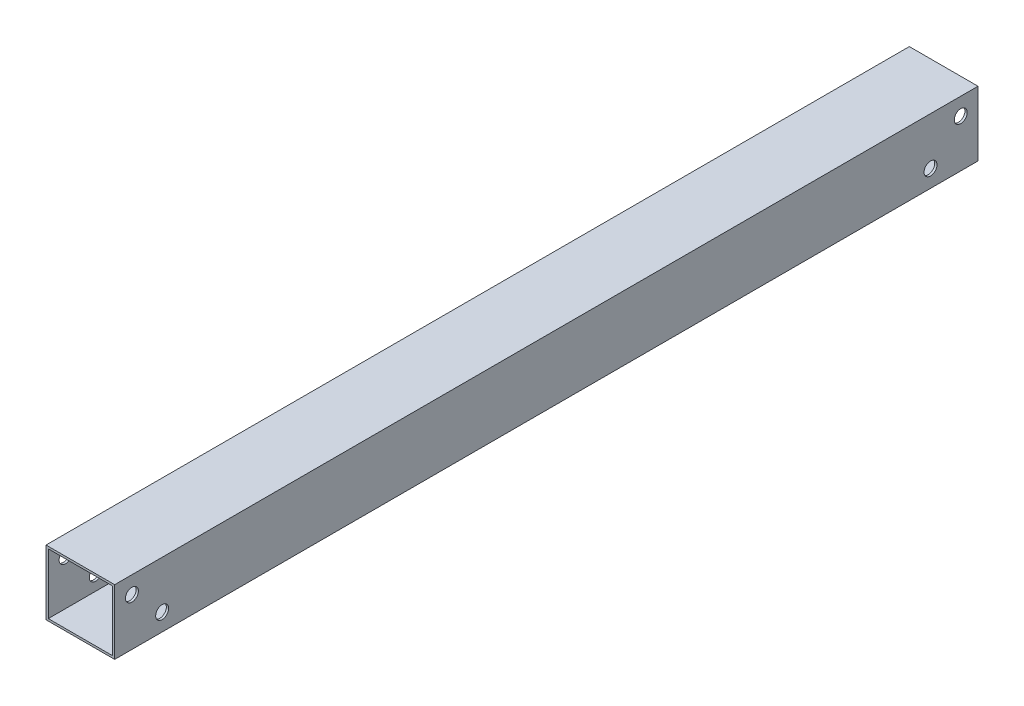
ISO-10303-21;
HEADER;
FILE_DESCRIPTION(('STEP AP214'),'2;1');
FILE_NAME('part.step','',(''),(''),'','','');
FILE_SCHEMA(('AUTOMOTIVE_DESIGN { 1 0 10303 214 1 1 1 1 }'));
ENDSEC;
DATA;
#1=APPLICATION_CONTEXT('core data for automotive mechanical design processes');
#2=APPLICATION_PROTOCOL_DEFINITION('international standard','automotive_design',2000,#1);
#3=PRODUCT_CONTEXT('',#1,'mechanical');
#4=PRODUCT('Part','Part','',(#3));
#5=PRODUCT_RELATED_PRODUCT_CATEGORY('part','',(#4));
#6=PRODUCT_DEFINITION_FORMATION('','',#4);
#7=PRODUCT_DEFINITION_CONTEXT('part definition',#1,'design');
#8=PRODUCT_DEFINITION('design','',#6,#7);
#9=PRODUCT_DEFINITION_SHAPE('','',#8);
#10=(LENGTH_UNIT() NAMED_UNIT(*) SI_UNIT(.MILLI.,.METRE.));
#11=(NAMED_UNIT(*) PLANE_ANGLE_UNIT() SI_UNIT($,.RADIAN.));
#12=(NAMED_UNIT(*) SI_UNIT($,.STERADIAN.) SOLID_ANGLE_UNIT());
#13=UNCERTAINTY_MEASURE_WITH_UNIT(LENGTH_MEASURE(1.E-05),#10,'distance_accuracy_value','');
#14=(GEOMETRIC_REPRESENTATION_CONTEXT(3) GLOBAL_UNCERTAINTY_ASSIGNED_CONTEXT((#13)) GLOBAL_UNIT_ASSIGNED_CONTEXT((#10,
#11,#12)) REPRESENTATION_CONTEXT('',''));
#15=CARTESIAN_POINT('',(0.,0.,0.));
#16=DIRECTION('',(0.,0.,1.));
#17=DIRECTION('',(1.,0.,0.));
#18=AXIS2_PLACEMENT_3D('',#15,#16,#17);
#19=CARTESIAN_POINT('',(0.,0.,-200.));
#20=DIRECTION('',(-1.,0.,0.));
#21=DIRECTION('',(0.,0.,1.));
#22=AXIS2_PLACEMENT_3D('',#19,#20,#21);
#23=PLANE('',#22);
#24=CARTESIAN_POINT('',(0.,11.,-4.));
#25=DIRECTION('',(-1.,0.,0.));
#26=DIRECTION('',(0.,0.,1.));
#27=AXIS2_PLACEMENT_3D('',#24,#25,#26);
#28=CIRCLE('',#27,1.5);
#29=CARTESIAN_POINT('',(0.,11.,-2.5));
#30=VERTEX_POINT('',#29);
#31=EDGE_CURVE('E137',#30,#30,#28,.T.);
#32=ORIENTED_EDGE('',*,*,#31,.F.);
#33=EDGE_LOOP('',(#32));
#34=FACE_BOUND('',#33,.T.);
#35=CARTESIAN_POINT('',(0.,4.,-11.));
#36=DIRECTION('',(-1.,0.,0.));
#37=DIRECTION('',(0.,0.,1.));
#38=AXIS2_PLACEMENT_3D('',#35,#36,#37);
#39=CIRCLE('',#38,1.5);
#40=CARTESIAN_POINT('',(0.,4.,-9.5));
#41=VERTEX_POINT('',#40);
#42=EDGE_CURVE('E221',#41,#41,#39,.T.);
#43=ORIENTED_EDGE('',*,*,#42,.F.);
#44=EDGE_LOOP('',(#43));
#45=FACE_BOUND('',#44,.T.);
#46=CARTESIAN_POINT('',(0.,4.,-189.));
#47=DIRECTION('',(-1.,0.,0.));
#48=DIRECTION('',(0.,0.,1.));
#49=AXIS2_PLACEMENT_3D('',#46,#47,#48);
#50=CIRCLE('',#49,1.5);
#51=CARTESIAN_POINT('',(0.,4.,-187.5));
#52=VERTEX_POINT('',#51);
#53=EDGE_CURVE('E215',#52,#52,#50,.T.);
#54=ORIENTED_EDGE('',*,*,#53,.F.);
#55=EDGE_LOOP('',(#54));
#56=FACE_BOUND('',#55,.T.);
#57=CARTESIAN_POINT('',(0.,11.,-196.));
#58=DIRECTION('',(-1.,0.,0.));
#59=DIRECTION('',(0.,0.,1.));
#60=AXIS2_PLACEMENT_3D('',#57,#58,#59);
#61=CIRCLE('',#60,1.5);
#62=CARTESIAN_POINT('',(0.,11.,-194.5));
#63=VERTEX_POINT('',#62);
#64=EDGE_CURVE('E210',#63,#63,#61,.T.);
#65=ORIENTED_EDGE('',*,*,#64,.F.);
#66=EDGE_LOOP('',(#65));
#67=FACE_BOUND('',#66,.T.);
#68=DIRECTION('',(0.,-1.,0.));
#69=VECTOR('',#68,1.);
#70=CARTESIAN_POINT('',(0.,0.,0.));
#71=LINE('',#70,#69);
#72=CARTESIAN_POINT('',(0.,15.,0.));
#73=VERTEX_POINT('',#72);
#74=CARTESIAN_POINT('',(0.,0.,0.));
#75=VERTEX_POINT('',#74);
#76=EDGE_CURVE('E155',#73,#75,#71,.T.);
#77=ORIENTED_EDGE('',*,*,#76,.F.);
#78=DIRECTION('',(0.,0.,1.));
#79=VECTOR('',#78,1.);
#80=CARTESIAN_POINT('',(0.,15.,-200.));
#81=LINE('',#80,#79);
#82=CARTESIAN_POINT('',(0.,15.,-200.));
#83=VERTEX_POINT('',#82);
#84=EDGE_CURVE('E11',#83,#73,#81,.T.);
#85=ORIENTED_EDGE('',*,*,#84,.F.);
#86=DIRECTION('',(0.,-1.,0.));
#87=VECTOR('',#86,1.);
#88=CARTESIAN_POINT('',(0.,0.,-200.));
#89=LINE('',#88,#87);
#90=CARTESIAN_POINT('',(0.,0.,-200.));
#91=VERTEX_POINT('',#90);
#92=EDGE_CURVE('E161',#83,#91,#89,.T.);
#93=ORIENTED_EDGE('',*,*,#92,.T.);
#94=DIRECTION('',(0.,0.,1.));
#95=VECTOR('',#94,1.);
#96=CARTESIAN_POINT('',(0.,0.,-200.));
#97=LINE('',#96,#95);
#98=EDGE_CURVE('E178',#91,#75,#97,.T.);
#99=ORIENTED_EDGE('',*,*,#98,.T.);
#100=EDGE_LOOP('',(#77,#85,#93,#99));
#101=FACE_BOUND('',#100,.T.);
#102=ADVANCED_FACE('F43',(#34,#45,#56,#67,#101),#23,.T.);
#103=CARTESIAN_POINT('',(0.,15.,-200.));
#104=DIRECTION('',(0.,1.,0.));
#105=DIRECTION('',(0.,0.,1.));
#106=AXIS2_PLACEMENT_3D('',#103,#104,#105);
#107=PLANE('',#106);
#108=DIRECTION('',(-1.,0.,0.));
#109=VECTOR('',#108,1.);
#110=CARTESIAN_POINT('',(0.,15.,0.));
#111=LINE('',#110,#109);
#112=CARTESIAN_POINT('',(15.9091063500961,15.,0.));
#113=VERTEX_POINT('',#112);
#114=EDGE_CURVE('E166',#113,#73,#111,.T.);
#115=ORIENTED_EDGE('',*,*,#114,.F.);
#116=DIRECTION('',(0.,0.,1.));
#117=VECTOR('',#116,1.);
#118=CARTESIAN_POINT('',(15.9091063500961,15.,-200.));
#119=LINE('',#118,#117);
#120=CARTESIAN_POINT('',(15.9091063500961,15.,-200.));
#121=VERTEX_POINT('',#120);
#122=EDGE_CURVE('E52',#121,#113,#119,.T.);
#123=ORIENTED_EDGE('',*,*,#122,.F.);
#124=DIRECTION('',(-1.,0.,0.));
#125=VECTOR('',#124,1.);
#126=CARTESIAN_POINT('',(0.,15.,-200.));
#127=LINE('',#126,#125);
#128=EDGE_CURVE('E174',#121,#83,#127,.T.);
#129=ORIENTED_EDGE('',*,*,#128,.T.);
#130=ORIENTED_EDGE('',*,*,#84,.T.);
#131=EDGE_LOOP('',(#115,#123,#129,#130));
#132=FACE_BOUND('',#131,.T.);
#133=ADVANCED_FACE('F269',(#132),#107,.T.);
#134=CARTESIAN_POINT('',(15.9091063500961,0.,-200.));
#135=DIRECTION('',(1.,0.,0.));
#136=DIRECTION('',(0.,0.,-1.));
#137=AXIS2_PLACEMENT_3D('',#134,#135,#136);
#138=PLANE('',#137);
#139=CARTESIAN_POINT('',(15.9091063500961,11.,-4.));
#140=DIRECTION('',(1.,0.,0.));
#141=DIRECTION('',(0.,0.,-1.));
#142=AXIS2_PLACEMENT_3D('',#139,#140,#141);
#143=CIRCLE('',#142,1.5);
#144=CARTESIAN_POINT('',(15.9091063500961,11.,-5.5));
#145=VERTEX_POINT('',#144);
#146=EDGE_CURVE('E205',#145,#145,#143,.T.);
#147=ORIENTED_EDGE('',*,*,#146,.F.);
#148=EDGE_LOOP('',(#147));
#149=FACE_BOUND('',#148,.T.);
#150=CARTESIAN_POINT('',(15.9091063500961,4.,-11.));
#151=DIRECTION('',(1.,0.,0.));
#152=DIRECTION('',(0.,0.,-1.));
#153=AXIS2_PLACEMENT_3D('',#150,#151,#152);
#154=CIRCLE('',#153,1.5);
#155=CARTESIAN_POINT('',(15.9091063500961,4.,-12.5));
#156=VERTEX_POINT('',#155);
#157=EDGE_CURVE('E331',#156,#156,#154,.T.);
#158=ORIENTED_EDGE('',*,*,#157,.F.);
#159=EDGE_LOOP('',(#158));
#160=FACE_BOUND('',#159,.T.);
#161=CARTESIAN_POINT('',(15.9091063500961,4.,-189.));
#162=DIRECTION('',(1.,0.,0.));
#163=DIRECTION('',(0.,0.,-1.));
#164=AXIS2_PLACEMENT_3D('',#161,#162,#163);
#165=CIRCLE('',#164,1.5);
#166=CARTESIAN_POINT('',(15.9091063500961,4.,-190.5));
#167=VERTEX_POINT('',#166);
#168=EDGE_CURVE('E348',#167,#167,#165,.T.);
#169=ORIENTED_EDGE('',*,*,#168,.F.);
#170=EDGE_LOOP('',(#169));
#171=FACE_BOUND('',#170,.T.);
#172=CARTESIAN_POINT('',(15.9091063500961,11.,-196.));
#173=DIRECTION('',(1.,0.,0.));
#174=DIRECTION('',(0.,0.,-1.));
#175=AXIS2_PLACEMENT_3D('',#172,#173,#174);
#176=CIRCLE('',#175,1.5);
#177=CARTESIAN_POINT('',(15.9091063500961,11.,-197.5));
#178=VERTEX_POINT('',#177);
#179=EDGE_CURVE('E344',#178,#178,#176,.T.);
#180=ORIENTED_EDGE('',*,*,#179,.F.);
#181=EDGE_LOOP('',(#180));
#182=FACE_BOUND('',#181,.T.);
#183=DIRECTION('',(0.,1.,0.));
#184=VECTOR('',#183,1.);
#185=CARTESIAN_POINT('',(15.9091063500961,0.,0.));
#186=LINE('',#185,#184);
#187=CARTESIAN_POINT('',(15.9091063500961,0.,0.));
#188=VERTEX_POINT('',#187);
#189=EDGE_CURVE('E186',#188,#113,#186,.T.);
#190=ORIENTED_EDGE('',*,*,#189,.F.);
#191=DIRECTION('',(0.,0.,1.));
#192=VECTOR('',#191,1.);
#193=CARTESIAN_POINT('',(15.9091063500961,0.,-200.));
#194=LINE('',#193,#192);
#195=CARTESIAN_POINT('',(15.9091063500961,0.,-200.));
#196=VERTEX_POINT('',#195);
#197=EDGE_CURVE('E195',#196,#188,#194,.T.);
#198=ORIENTED_EDGE('',*,*,#197,.F.);
#199=DIRECTION('',(0.,1.,0.));
#200=VECTOR('',#199,1.);
#201=CARTESIAN_POINT('',(15.9091063500961,0.,-200.));
#202=LINE('',#201,#200);
#203=EDGE_CURVE('E170',#196,#121,#202,.T.);
#204=ORIENTED_EDGE('',*,*,#203,.T.);
#205=ORIENTED_EDGE('',*,*,#122,.T.);
#206=EDGE_LOOP('',(#190,#198,#204,#205));
#207=FACE_BOUND('',#206,.T.);
#208=ADVANCED_FACE('F274',(#149,#160,#171,#182,#207),#138,.T.);
#209=CARTESIAN_POINT('',(0.,0.,-200.));
#210=DIRECTION('',(0.,-1.,0.));
#211=DIRECTION('',(1.,0.,0.));
#212=AXIS2_PLACEMENT_3D('',#209,#210,#211);
#213=PLANE('',#212);
#214=DIRECTION('',(1.,0.,0.));
#215=VECTOR('',#214,1.);
#216=CARTESIAN_POINT('',(0.,0.,0.));
#217=LINE('',#216,#215);
#218=EDGE_CURVE('E182',#75,#188,#217,.T.);
#219=ORIENTED_EDGE('',*,*,#218,.F.);
#220=ORIENTED_EDGE('',*,*,#98,.F.);
#221=DIRECTION('',(1.,0.,0.));
#222=VECTOR('',#221,1.);
#223=CARTESIAN_POINT('',(0.,0.,-200.));
#224=LINE('',#223,#222);
#225=EDGE_CURVE('E165',#91,#196,#224,.T.);
#226=ORIENTED_EDGE('',*,*,#225,.T.);
#227=ORIENTED_EDGE('',*,*,#197,.T.);
#228=EDGE_LOOP('',(#219,#220,#226,#227));
#229=FACE_BOUND('',#228,.T.);
#230=ADVANCED_FACE('F296',(#229),#213,.T.);
#231=CARTESIAN_POINT('',(0.,0.,-200.));
#232=DIRECTION('',(0.,0.,-1.));
#233=DIRECTION('',(-1.,0.,0.));
#234=AXIS2_PLACEMENT_3D('',#231,#232,#233);
#235=PLANE('',#234);
#236=DIRECTION('',(0.,1.,0.));
#237=VECTOR('',#236,1.);
#238=CARTESIAN_POINT('',(15.3788028050929,14.5,-200.));
#239=LINE('',#238,#237);
#240=CARTESIAN_POINT('',(15.3788028050929,0.499999999999997,-200.));
#241=VERTEX_POINT('',#240);
#242=CARTESIAN_POINT('',(15.3788028050929,14.5,-200.));
#243=VERTEX_POINT('',#242);
#244=EDGE_CURVE('E111',#241,#243,#239,.T.);
#245=ORIENTED_EDGE('',*,*,#244,.T.);
#246=DIRECTION('',(-1.,0.,0.));
#247=VECTOR('',#246,1.);
#248=CARTESIAN_POINT('',(0.530303545003203,14.5,-200.));
#249=LINE('',#248,#247);
#250=CARTESIAN_POINT('',(0.530303545003203,14.5,-200.));
#251=VERTEX_POINT('',#250);
#252=EDGE_CURVE('E121',#243,#251,#249,.T.);
#253=ORIENTED_EDGE('',*,*,#252,.T.);
#254=DIRECTION('',(0.,-1.,0.));
#255=VECTOR('',#254,1.);
#256=CARTESIAN_POINT('',(0.530303545003203,14.5,-200.));
#257=LINE('',#256,#255);
#258=CARTESIAN_POINT('',(0.530303545003203,0.499999999999997,-200.));
#259=VERTEX_POINT('',#258);
#260=EDGE_CURVE('E60',#251,#259,#257,.T.);
#261=ORIENTED_EDGE('',*,*,#260,.T.);
#262=DIRECTION('',(1.,0.,0.));
#263=VECTOR('',#262,1.);
#264=CARTESIAN_POINT('',(0.530303545003203,0.499999999999997,-200.));
#265=LINE('',#264,#263);
#266=EDGE_CURVE('E118',#259,#241,#265,.T.);
#267=ORIENTED_EDGE('',*,*,#266,.T.);
#268=EDGE_LOOP('',(#245,#253,#261,#267));
#269=FACE_BOUND('',#268,.T.);
#270=ORIENTED_EDGE('',*,*,#92,.F.);
#271=ORIENTED_EDGE('',*,*,#128,.F.);
#272=ORIENTED_EDGE('',*,*,#203,.F.);
#273=ORIENTED_EDGE('',*,*,#225,.F.);
#274=EDGE_LOOP('',(#270,#271,#272,#273));
#275=FACE_BOUND('',#274,.T.);
#276=ADVANCED_FACE('F126',(#269,#275),#235,.T.);
#277=CARTESIAN_POINT('',(0.,0.,0.));
#278=DIRECTION('',(0.,0.,-1.));
#279=DIRECTION('',(-1.,0.,0.));
#280=AXIS2_PLACEMENT_3D('',#277,#278,#279);
#281=PLANE('',#280);
#282=DIRECTION('',(-1.,0.,0.));
#283=VECTOR('',#282,1.);
#284=CARTESIAN_POINT('',(0.530303545003203,14.5,0.));
#285=LINE('',#284,#283);
#286=CARTESIAN_POINT('',(15.3788028050929,14.5,0.));
#287=VERTEX_POINT('',#286);
#288=CARTESIAN_POINT('',(0.530303545003203,14.5,0.));
#289=VERTEX_POINT('',#288);
#290=EDGE_CURVE('E146',#287,#289,#285,.T.);
#291=ORIENTED_EDGE('',*,*,#290,.F.);
#292=DIRECTION('',(0.,1.,0.));
#293=VECTOR('',#292,1.);
#294=CARTESIAN_POINT('',(15.3788028050929,14.5,0.));
#295=LINE('',#294,#293);
#296=CARTESIAN_POINT('',(15.3788028050929,0.499999999999997,0.));
#297=VERTEX_POINT('',#296);
#298=EDGE_CURVE('E68',#297,#287,#295,.T.);
#299=ORIENTED_EDGE('',*,*,#298,.F.);
#300=DIRECTION('',(1.,0.,0.));
#301=VECTOR('',#300,1.);
#302=CARTESIAN_POINT('',(0.530303545003203,0.499999999999997,0.));
#303=LINE('',#302,#301);
#304=CARTESIAN_POINT('',(0.530303545003203,0.499999999999997,0.));
#305=VERTEX_POINT('',#304);
#306=EDGE_CURVE('E130',#305,#297,#303,.T.);
#307=ORIENTED_EDGE('',*,*,#306,.F.);
#308=DIRECTION('',(0.,-1.,0.));
#309=VECTOR('',#308,1.);
#310=CARTESIAN_POINT('',(0.530303545003203,14.5,0.));
#311=LINE('',#310,#309);
#312=EDGE_CURVE('E134',#289,#305,#311,.T.);
#313=ORIENTED_EDGE('',*,*,#312,.F.);
#314=EDGE_LOOP('',(#291,#299,#307,#313));
#315=FACE_BOUND('',#314,.T.);
#316=ORIENTED_EDGE('',*,*,#76,.T.);
#317=ORIENTED_EDGE('',*,*,#218,.T.);
#318=ORIENTED_EDGE('',*,*,#189,.T.);
#319=ORIENTED_EDGE('',*,*,#114,.T.);
#320=EDGE_LOOP('',(#316,#317,#318,#319));
#321=FACE_BOUND('',#320,.T.);
#322=ADVANCED_FACE('F290',(#315,#321),#281,.F.);
#323=CARTESIAN_POINT('',(15.3788028050929,14.5,-200.));
#324=DIRECTION('',(1.,0.,0.));
#325=DIRECTION('',(0.,1.,0.));
#326=AXIS2_PLACEMENT_3D('',#323,#324,#325);
#327=PLANE('',#326);
#328=CARTESIAN_POINT('',(15.3788028050929,11.,-4.));
#329=DIRECTION('',(1.,0.,0.));
#330=DIRECTION('',(0.,1.,0.));
#331=AXIS2_PLACEMENT_3D('',#328,#329,#330);
#332=CIRCLE('',#331,1.5);
#333=CARTESIAN_POINT('',(15.3788028050929,12.5,-4.));
#334=VERTEX_POINT('',#333);
#335=EDGE_CURVE('E234',#334,#334,#332,.T.);
#336=ORIENTED_EDGE('',*,*,#335,.T.);
#337=EDGE_LOOP('',(#336));
#338=FACE_BOUND('',#337,.T.);
#339=CARTESIAN_POINT('',(15.3788028050929,4.,-11.));
#340=DIRECTION('',(1.,0.,0.));
#341=DIRECTION('',(0.,1.,0.));
#342=AXIS2_PLACEMENT_3D('',#339,#340,#341);
#343=CIRCLE('',#342,1.5);
#344=CARTESIAN_POINT('',(15.3788028050929,5.5,-11.));
#345=VERTEX_POINT('',#344);
#346=EDGE_CURVE('E214',#345,#345,#343,.T.);
#347=ORIENTED_EDGE('',*,*,#346,.T.);
#348=EDGE_LOOP('',(#347));
#349=FACE_BOUND('',#348,.T.);
#350=CARTESIAN_POINT('',(15.3788028050929,4.,-189.));
#351=DIRECTION('',(1.,0.,0.));
#352=DIRECTION('',(0.,1.,0.));
#353=AXIS2_PLACEMENT_3D('',#350,#351,#352);
#354=CIRCLE('',#353,1.5);
#355=CARTESIAN_POINT('',(15.3788028050929,5.5,-189.));
#356=VERTEX_POINT('',#355);
#357=EDGE_CURVE('E209',#356,#356,#354,.T.);
#358=ORIENTED_EDGE('',*,*,#357,.T.);
#359=EDGE_LOOP('',(#358));
#360=FACE_BOUND('',#359,.T.);
#361=CARTESIAN_POINT('',(15.3788028050929,11.,-196.));
#362=DIRECTION('',(1.,0.,0.));
#363=DIRECTION('',(0.,1.,0.));
#364=AXIS2_PLACEMENT_3D('',#361,#362,#363);
#365=CIRCLE('',#364,1.5);
#366=CARTESIAN_POINT('',(15.3788028050929,12.5,-196.));
#367=VERTEX_POINT('',#366);
#368=EDGE_CURVE('E204',#367,#367,#365,.T.);
#369=ORIENTED_EDGE('',*,*,#368,.T.);
#370=EDGE_LOOP('',(#369));
#371=FACE_BOUND('',#370,.T.);
#372=ORIENTED_EDGE('',*,*,#298,.T.);
#373=DIRECTION('',(0.,0.,1.));
#374=VECTOR('',#373,1.);
#375=CARTESIAN_POINT('',(15.3788028050929,14.5,-200.));
#376=LINE('',#375,#374);
#377=EDGE_CURVE('E107',#243,#287,#376,.T.);
#378=ORIENTED_EDGE('',*,*,#377,.F.);
#379=ORIENTED_EDGE('',*,*,#244,.F.);
#380=DIRECTION('',(0.,0.,1.));
#381=VECTOR('',#380,1.);
#382=CARTESIAN_POINT('',(15.3788028050929,0.499999999999997,-200.));
#383=LINE('',#382,#381);
#384=EDGE_CURVE('E152',#241,#297,#383,.T.);
#385=ORIENTED_EDGE('',*,*,#384,.T.);
#386=EDGE_LOOP('',(#372,#378,#379,#385));
#387=FACE_BOUND('',#386,.T.);
#388=ADVANCED_FACE('F109',(#338,#349,#360,#371,#387),#327,.F.);
#389=CARTESIAN_POINT('',(0.530303545003203,0.499999999999997,-200.));
#390=DIRECTION('',(0.,-1.,0.));
#391=DIRECTION('',(0.,0.,-1.));
#392=AXIS2_PLACEMENT_3D('',#389,#390,#391);
#393=PLANE('',#392);
#394=ORIENTED_EDGE('',*,*,#306,.T.);
#395=ORIENTED_EDGE('',*,*,#384,.F.);
#396=ORIENTED_EDGE('',*,*,#266,.F.);
#397=DIRECTION('',(0.,0.,1.));
#398=VECTOR('',#397,1.);
#399=CARTESIAN_POINT('',(0.530303545003203,0.499999999999997,-200.));
#400=LINE('',#399,#398);
#401=EDGE_CURVE('E156',#259,#305,#400,.T.);
#402=ORIENTED_EDGE('',*,*,#401,.T.);
#403=EDGE_LOOP('',(#394,#395,#396,#402));
#404=FACE_BOUND('',#403,.T.);
#405=ADVANCED_FACE('F314',(#404),#393,.F.);
#406=CARTESIAN_POINT('',(0.530303545003203,14.5,-200.));
#407=DIRECTION('',(-1.,0.,0.));
#408=DIRECTION('',(0.,0.,1.));
#409=AXIS2_PLACEMENT_3D('',#406,#407,#408);
#410=PLANE('',#409);
#411=CARTESIAN_POINT('',(0.530303545003203,11.,-4.));
#412=DIRECTION('',(-1.,0.,0.));
#413=DIRECTION('',(0.,0.,1.));
#414=AXIS2_PLACEMENT_3D('',#411,#412,#413);
#415=CIRCLE('',#414,1.5);
#416=CARTESIAN_POINT('',(0.530303545003203,11.,-2.5));
#417=VERTEX_POINT('',#416);
#418=EDGE_CURVE('E46',#417,#417,#415,.T.);
#419=ORIENTED_EDGE('',*,*,#418,.T.);
#420=EDGE_LOOP('',(#419));
#421=FACE_BOUND('',#420,.T.);
#422=CARTESIAN_POINT('',(0.530303545003203,4.,-11.));
#423=DIRECTION('',(-1.,0.,0.));
#424=DIRECTION('',(0.,0.,1.));
#425=AXIS2_PLACEMENT_3D('',#422,#423,#424);
#426=CIRCLE('',#425,1.5);
#427=CARTESIAN_POINT('',(0.530303545003203,4.,-9.5));
#428=VERTEX_POINT('',#427);
#429=EDGE_CURVE('E211',#428,#428,#426,.T.);
#430=ORIENTED_EDGE('',*,*,#429,.T.);
#431=EDGE_LOOP('',(#430));
#432=FACE_BOUND('',#431,.T.);
#433=CARTESIAN_POINT('',(0.530303545003203,4.,-189.));
#434=DIRECTION('',(-1.,0.,0.));
#435=DIRECTION('',(0.,0.,1.));
#436=AXIS2_PLACEMENT_3D('',#433,#434,#435);
#437=CIRCLE('',#436,1.5);
#438=CARTESIAN_POINT('',(0.530303545003203,4.,-187.5));
#439=VERTEX_POINT('',#438);
#440=EDGE_CURVE('E206',#439,#439,#437,.T.);
#441=ORIENTED_EDGE('',*,*,#440,.T.);
#442=EDGE_LOOP('',(#441));
#443=FACE_BOUND('',#442,.T.);
#444=CARTESIAN_POINT('',(0.530303545003203,11.,-196.));
#445=DIRECTION('',(-1.,0.,0.));
#446=DIRECTION('',(0.,0.,1.));
#447=AXIS2_PLACEMENT_3D('',#444,#445,#446);
#448=CIRCLE('',#447,1.5);
#449=CARTESIAN_POINT('',(0.530303545003203,11.,-194.5));
#450=VERTEX_POINT('',#449);
#451=EDGE_CURVE('E200',#450,#450,#448,.T.);
#452=ORIENTED_EDGE('',*,*,#451,.T.);
#453=EDGE_LOOP('',(#452));
#454=FACE_BOUND('',#453,.T.);
#455=ORIENTED_EDGE('',*,*,#312,.T.);
#456=ORIENTED_EDGE('',*,*,#401,.F.);
#457=ORIENTED_EDGE('',*,*,#260,.F.);
#458=DIRECTION('',(0.,0.,1.));
#459=VECTOR('',#458,1.);
#460=CARTESIAN_POINT('',(0.530303545003203,14.5,-200.));
#461=LINE('',#460,#459);
#462=EDGE_CURVE('E117',#251,#289,#461,.T.);
#463=ORIENTED_EDGE('',*,*,#462,.T.);
#464=EDGE_LOOP('',(#455,#456,#457,#463));
#465=FACE_BOUND('',#464,.T.);
#466=ADVANCED_FACE('F245',(#421,#432,#443,#454,#465),#410,.F.);
#467=CARTESIAN_POINT('',(0.530303545003203,14.5,-200.));
#468=DIRECTION('',(0.,1.,0.));
#469=DIRECTION('',(0.,0.,1.));
#470=AXIS2_PLACEMENT_3D('',#467,#468,#469);
#471=PLANE('',#470);
#472=ORIENTED_EDGE('',*,*,#290,.T.);
#473=ORIENTED_EDGE('',*,*,#462,.F.);
#474=ORIENTED_EDGE('',*,*,#252,.F.);
#475=ORIENTED_EDGE('',*,*,#377,.T.);
#476=EDGE_LOOP('',(#472,#473,#474,#475));
#477=FACE_BOUND('',#476,.T.);
#478=ADVANCED_FACE('F122',(#477),#471,.F.);
#479=CARTESIAN_POINT('',(-4.09089364990388,11.,-196.));
#480=DIRECTION('',(1.,0.,0.));
#481=DIRECTION('',(0.,0.,-1.));
#482=AXIS2_PLACEMENT_3D('',#479,#480,#481);
#483=CYLINDRICAL_SURFACE('',#482,1.5);
#484=ORIENTED_EDGE('',*,*,#64,.T.);
#485=EDGE_LOOP('',(#484));
#486=FACE_BOUND('',#485,.T.);
#487=ORIENTED_EDGE('',*,*,#451,.F.);
#488=EDGE_LOOP('',(#487));
#489=FACE_BOUND('',#488,.T.);
#490=ADVANCED_FACE('F261',(#486,#489),#483,.F.);
#491=CARTESIAN_POINT('',(-4.09089364990388,4.,-189.));
#492=DIRECTION('',(1.,0.,0.));
#493=DIRECTION('',(0.,0.,-1.));
#494=AXIS2_PLACEMENT_3D('',#491,#492,#493);
#495=CYLINDRICAL_SURFACE('',#494,1.5);
#496=ORIENTED_EDGE('',*,*,#53,.T.);
#497=EDGE_LOOP('',(#496));
#498=FACE_BOUND('',#497,.T.);
#499=ORIENTED_EDGE('',*,*,#440,.F.);
#500=EDGE_LOOP('',(#499));
#501=FACE_BOUND('',#500,.T.);
#502=ADVANCED_FACE('F262',(#498,#501),#495,.F.);
#503=CARTESIAN_POINT('',(-4.09089364990388,4.,-11.));
#504=DIRECTION('',(1.,0.,0.));
#505=DIRECTION('',(0.,0.,-1.));
#506=AXIS2_PLACEMENT_3D('',#503,#504,#505);
#507=CYLINDRICAL_SURFACE('',#506,1.5);
#508=ORIENTED_EDGE('',*,*,#42,.T.);
#509=EDGE_LOOP('',(#508));
#510=FACE_BOUND('',#509,.T.);
#511=ORIENTED_EDGE('',*,*,#429,.F.);
#512=EDGE_LOOP('',(#511));
#513=FACE_BOUND('',#512,.T.);
#514=ADVANCED_FACE('F250',(#510,#513),#507,.F.);
#515=CARTESIAN_POINT('',(-4.09089364990388,11.,-4.));
#516=DIRECTION('',(1.,0.,0.));
#517=DIRECTION('',(0.,0.,-1.));
#518=AXIS2_PLACEMENT_3D('',#515,#516,#517);
#519=CYLINDRICAL_SURFACE('',#518,1.5);
#520=ORIENTED_EDGE('',*,*,#31,.T.);
#521=EDGE_LOOP('',(#520));
#522=FACE_BOUND('',#521,.T.);
#523=ORIENTED_EDGE('',*,*,#418,.F.);
#524=EDGE_LOOP('',(#523));
#525=FACE_BOUND('',#524,.T.);
#526=ADVANCED_FACE('F247',(#522,#525),#519,.F.);
#527=ORIENTED_EDGE('',*,*,#179,.T.);
#528=EDGE_LOOP('',(#527));
#529=FACE_BOUND('',#528,.T.);
#530=ORIENTED_EDGE('',*,*,#368,.F.);
#531=EDGE_LOOP('',(#530));
#532=FACE_BOUND('',#531,.T.);
#533=ADVANCED_FACE('F249',(#529,#532),#483,.F.);
#534=ORIENTED_EDGE('',*,*,#168,.T.);
#535=EDGE_LOOP('',(#534));
#536=FACE_BOUND('',#535,.T.);
#537=ORIENTED_EDGE('',*,*,#357,.F.);
#538=EDGE_LOOP('',(#537));
#539=FACE_BOUND('',#538,.T.);
#540=ADVANCED_FACE('F258',(#536,#539),#495,.F.);
#541=ORIENTED_EDGE('',*,*,#157,.T.);
#542=EDGE_LOOP('',(#541));
#543=FACE_BOUND('',#542,.T.);
#544=ORIENTED_EDGE('',*,*,#346,.F.);
#545=EDGE_LOOP('',(#544));
#546=FACE_BOUND('',#545,.T.);
#547=ADVANCED_FACE('F265',(#543,#546),#507,.F.);
#548=ORIENTED_EDGE('',*,*,#146,.T.);
#549=EDGE_LOOP('',(#548));
#550=FACE_BOUND('',#549,.T.);
#551=ORIENTED_EDGE('',*,*,#335,.F.);
#552=EDGE_LOOP('',(#551));
#553=FACE_BOUND('',#552,.T.);
#554=ADVANCED_FACE('F253',(#550,#553),#519,.F.);
#555=CLOSED_SHELL('',(#102,#133,#208,#230,#276,#322,#388,#405,#466,#478,#490,#502,#514,#526,
#533,#540,#547,#554));
#556=MANIFOLD_SOLID_BREP('B2',#555);
#557=ADVANCED_BREP_SHAPE_REPRESENTATION('',(#18,#556),#14);
#558=SHAPE_DEFINITION_REPRESENTATION(#9,#557);
ENDSEC;
END-ISO-10303-21;
